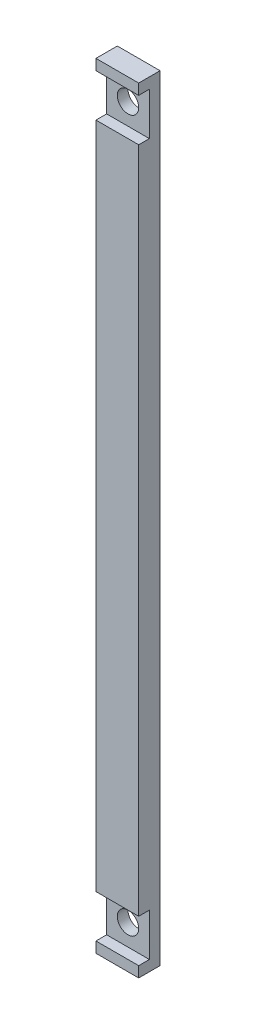
ISO-10303-21;
HEADER;
FILE_DESCRIPTION(('STEP AP214'),'2;1');
FILE_NAME('part.step','',(''),(''),'','','');
FILE_SCHEMA(('AUTOMOTIVE_DESIGN { 1 0 10303 214 1 1 1 1 }'));
ENDSEC;
DATA;
#1=APPLICATION_CONTEXT('core data for automotive mechanical design processes');
#2=APPLICATION_PROTOCOL_DEFINITION('international standard','automotive_design',2000,#1);
#3=PRODUCT_CONTEXT('',#1,'mechanical');
#4=PRODUCT('Part','Part','',(#3));
#5=PRODUCT_RELATED_PRODUCT_CATEGORY('part','',(#4));
#6=PRODUCT_DEFINITION_FORMATION('','',#4);
#7=PRODUCT_DEFINITION_CONTEXT('part definition',#1,'design');
#8=PRODUCT_DEFINITION('design','',#6,#7);
#9=PRODUCT_DEFINITION_SHAPE('','',#8);
#10=(LENGTH_UNIT() NAMED_UNIT(*) SI_UNIT(.MILLI.,.METRE.));
#11=(NAMED_UNIT(*) PLANE_ANGLE_UNIT() SI_UNIT($,.RADIAN.));
#12=(NAMED_UNIT(*) SI_UNIT($,.STERADIAN.) SOLID_ANGLE_UNIT());
#13=UNCERTAINTY_MEASURE_WITH_UNIT(LENGTH_MEASURE(1.E-05),#10,'distance_accuracy_value','');
#14=(GEOMETRIC_REPRESENTATION_CONTEXT(3) GLOBAL_UNCERTAINTY_ASSIGNED_CONTEXT((#13)) GLOBAL_UNIT_ASSIGNED_CONTEXT((#10,
#11,#12)) REPRESENTATION_CONTEXT('',''));
#15=CARTESIAN_POINT('',(0.,0.,0.));
#16=DIRECTION('',(0.,0.,1.));
#17=DIRECTION('',(1.,0.,0.));
#18=AXIS2_PLACEMENT_3D('',#15,#16,#17);
#19=CARTESIAN_POINT('',(0.,460.375,0.));
#20=DIRECTION('',(0.,0.,-1.));
#21=DIRECTION('',(-1.,0.,0.));
#22=AXIS2_PLACEMENT_3D('',#19,#20,#21);
#23=PLANE('',#22);
#24=DIRECTION('',(1.,0.,0.));
#25=VECTOR('',#24,1.);
#26=CARTESIAN_POINT('',(0.,428.625,0.));
#27=LINE('',#26,#25);
#28=CARTESIAN_POINT('',(0.,428.625,0.));
#29=VERTEX_POINT('',#28);
#30=CARTESIAN_POINT('',(25.4,428.625,0.));
#31=VERTEX_POINT('',#30);
#32=EDGE_CURVE('E133',#29,#31,#27,.T.);
#33=ORIENTED_EDGE('',*,*,#32,.F.);
#34=DIRECTION('',(0.,-1.,0.));
#35=VECTOR('',#34,1.);
#36=CARTESIAN_POINT('',(0.,460.375,0.));
#37=LINE('',#36,#35);
#38=CARTESIAN_POINT('',(0.,31.75,0.));
#39=VERTEX_POINT('',#38);
#40=EDGE_CURVE('E51',#29,#39,#37,.T.);
#41=ORIENTED_EDGE('',*,*,#40,.T.);
#42=DIRECTION('',(1.,0.,0.));
#43=VECTOR('',#42,1.);
#44=CARTESIAN_POINT('',(0.,31.75,0.));
#45=LINE('',#44,#43);
#46=CARTESIAN_POINT('',(25.4,31.75,0.));
#47=VERTEX_POINT('',#46);
#48=EDGE_CURVE('E211',#39,#47,#45,.T.);
#49=ORIENTED_EDGE('',*,*,#48,.T.);
#50=DIRECTION('',(0.,-1.,0.));
#51=VECTOR('',#50,1.);
#52=CARTESIAN_POINT('',(25.4,460.375,0.));
#53=LINE('',#52,#51);
#54=EDGE_CURVE('E146',#31,#47,#53,.T.);
#55=ORIENTED_EDGE('',*,*,#54,.F.);
#56=EDGE_LOOP('',(#33,#41,#49,#55));
#57=FACE_BOUND('',#56,.T.);
#58=ADVANCED_FACE('F43',(#57),#23,.F.);
#59=DIRECTION('',(1.,0.,0.));
#60=VECTOR('',#59,1.);
#61=CARTESIAN_POINT('',(0.,6.35,0.));
#62=LINE('',#61,#60);
#63=CARTESIAN_POINT('',(0.,6.35,0.));
#64=VERTEX_POINT('',#63);
#65=CARTESIAN_POINT('',(25.4,6.35,0.));
#66=VERTEX_POINT('',#65);
#67=EDGE_CURVE('E202',#64,#66,#62,.T.);
#68=ORIENTED_EDGE('',*,*,#67,.F.);
#69=CARTESIAN_POINT('',(0.,0.,0.));
#70=VERTEX_POINT('',#69);
#71=EDGE_CURVE('E55',#64,#70,#37,.T.);
#72=ORIENTED_EDGE('',*,*,#71,.T.);
#73=DIRECTION('',(1.,0.,0.));
#74=VECTOR('',#73,1.);
#75=CARTESIAN_POINT('',(0.,0.,0.));
#76=LINE('',#75,#74);
#77=CARTESIAN_POINT('',(25.4,0.,0.));
#78=VERTEX_POINT('',#77);
#79=EDGE_CURVE('E183',#70,#78,#76,.T.);
#80=ORIENTED_EDGE('',*,*,#79,.T.);
#81=EDGE_CURVE('E165',#66,#78,#53,.T.);
#82=ORIENTED_EDGE('',*,*,#81,.F.);
#83=EDGE_LOOP('',(#68,#72,#80,#82));
#84=FACE_BOUND('',#83,.T.);
#85=ADVANCED_FACE('F277',(#84),#23,.F.);
#86=CARTESIAN_POINT('',(25.4,460.375,0.));
#87=DIRECTION('',(-1.,0.,0.));
#88=DIRECTION('',(0.,0.,1.));
#89=AXIS2_PLACEMENT_3D('',#86,#87,#88);
#90=PLANE('',#89);
#91=DIRECTION('',(0.,0.,-1.));
#92=VECTOR('',#91,1.);
#93=CARTESIAN_POINT('',(25.4,428.625,0.));
#94=LINE('',#93,#92);
#95=CARTESIAN_POINT('',(25.4,428.625,-6.35));
#96=VERTEX_POINT('',#95);
#97=EDGE_CURVE('E56',#31,#96,#94,.T.);
#98=ORIENTED_EDGE('',*,*,#97,.F.);
#99=ORIENTED_EDGE('',*,*,#54,.T.);
#100=DIRECTION('',(0.,0.,1.));
#101=VECTOR('',#100,1.);
#102=CARTESIAN_POINT('',(25.4,31.75,0.));
#103=LINE('',#102,#101);
#104=CARTESIAN_POINT('',(25.4,31.75,-6.35000000000005));
#105=VERTEX_POINT('',#104);
#106=EDGE_CURVE('E203',#105,#47,#103,.T.);
#107=ORIENTED_EDGE('',*,*,#106,.F.);
#108=DIRECTION('',(0.,1.,0.));
#109=VECTOR('',#108,1.);
#110=CARTESIAN_POINT('',(25.4,6.35,-6.35000000000005));
#111=LINE('',#110,#109);
#112=CARTESIAN_POINT('',(25.4,6.34999999999997,-6.35000000000005));
#113=VERTEX_POINT('',#112);
#114=EDGE_CURVE('E210',#113,#105,#111,.T.);
#115=ORIENTED_EDGE('',*,*,#114,.F.);
#116=DIRECTION('',(0.,0.,-1.));
#117=VECTOR('',#116,1.);
#118=CARTESIAN_POINT('',(25.4,6.35,0.));
#119=LINE('',#118,#117);
#120=EDGE_CURVE('E66',#66,#113,#119,.T.);
#121=ORIENTED_EDGE('',*,*,#120,.F.);
#122=ORIENTED_EDGE('',*,*,#81,.T.);
#123=DIRECTION('',(0.,0.,-1.));
#124=VECTOR('',#123,1.);
#125=CARTESIAN_POINT('',(25.4,0.,0.));
#126=LINE('',#125,#124);
#127=CARTESIAN_POINT('',(25.4,0.,-12.7));
#128=VERTEX_POINT('',#127);
#129=EDGE_CURVE('E181',#78,#128,#126,.T.);
#130=ORIENTED_EDGE('',*,*,#129,.T.);
#131=DIRECTION('',(0.,-1.,0.));
#132=VECTOR('',#131,1.);
#133=CARTESIAN_POINT('',(25.4,460.375,-12.7));
#134=LINE('',#133,#132);
#135=CARTESIAN_POINT('',(25.4,460.375,-12.7));
#136=VERTEX_POINT('',#135);
#137=EDGE_CURVE('E169',#136,#128,#134,.T.);
#138=ORIENTED_EDGE('',*,*,#137,.F.);
#139=DIRECTION('',(0.,0.,-1.));
#140=VECTOR('',#139,1.);
#141=CARTESIAN_POINT('',(25.4,460.375,0.));
#142=LINE('',#141,#140);
#143=CARTESIAN_POINT('',(25.4,460.375,0.));
#144=VERTEX_POINT('',#143);
#145=EDGE_CURVE('E191',#144,#136,#142,.T.);
#146=ORIENTED_EDGE('',*,*,#145,.F.);
#147=CARTESIAN_POINT('',(25.4,454.025,0.));
#148=VERTEX_POINT('',#147);
#149=EDGE_CURVE('E154',#144,#148,#53,.T.);
#150=ORIENTED_EDGE('',*,*,#149,.T.);
#151=DIRECTION('',(0.,0.,1.));
#152=VECTOR('',#151,1.);
#153=CARTESIAN_POINT('',(25.4,454.025,0.));
#154=LINE('',#153,#152);
#155=CARTESIAN_POINT('',(25.4,454.025,-6.35));
#156=VERTEX_POINT('',#155);
#157=EDGE_CURVE('E143',#156,#148,#154,.T.);
#158=ORIENTED_EDGE('',*,*,#157,.F.);
#159=DIRECTION('',(0.,1.,0.));
#160=VECTOR('',#159,1.);
#161=CARTESIAN_POINT('',(25.4,454.025,-6.35));
#162=LINE('',#161,#160);
#163=EDGE_CURVE('E223',#96,#156,#162,.T.);
#164=ORIENTED_EDGE('',*,*,#163,.F.);
#165=EDGE_LOOP('',(#98,#99,#107,#115,#121,#122,#130,#138,#146,#150,#158,#164));
#166=FACE_BOUND('',#165,.T.);
#167=ADVANCED_FACE('F261',(#166),#90,.F.);
#168=CARTESIAN_POINT('',(0.,460.375,0.));
#169=DIRECTION('',(1.,0.,0.));
#170=DIRECTION('',(0.,0.,-1.));
#171=AXIS2_PLACEMENT_3D('',#168,#169,#170);
#172=PLANE('',#171);
#173=DIRECTION('',(0.,1.,0.));
#174=VECTOR('',#173,1.);
#175=CARTESIAN_POINT('',(0.,454.025,-6.35));
#176=LINE('',#175,#174);
#177=CARTESIAN_POINT('',(0.,428.625,-6.35));
#178=VERTEX_POINT('',#177);
#179=CARTESIAN_POINT('',(0.,454.025,-6.35));
#180=VERTEX_POINT('',#179);
#181=EDGE_CURVE('E137',#178,#180,#176,.T.);
#182=ORIENTED_EDGE('',*,*,#181,.T.);
#183=DIRECTION('',(0.,0.,1.));
#184=VECTOR('',#183,1.);
#185=CARTESIAN_POINT('',(0.,454.025,0.));
#186=LINE('',#185,#184);
#187=CARTESIAN_POINT('',(0.,454.025,0.));
#188=VERTEX_POINT('',#187);
#189=EDGE_CURVE('E149',#180,#188,#186,.T.);
#190=ORIENTED_EDGE('',*,*,#189,.T.);
#191=CARTESIAN_POINT('',(0.,460.375,0.));
#192=VERTEX_POINT('',#191);
#193=EDGE_CURVE('E11',#192,#188,#37,.T.);
#194=ORIENTED_EDGE('',*,*,#193,.F.);
#195=DIRECTION('',(0.,0.,1.));
#196=VECTOR('',#195,1.);
#197=CARTESIAN_POINT('',(0.,460.375,0.));
#198=LINE('',#197,#196);
#199=CARTESIAN_POINT('',(0.,460.375,-12.7));
#200=VERTEX_POINT('',#199);
#201=EDGE_CURVE('E185',#200,#192,#198,.T.);
#202=ORIENTED_EDGE('',*,*,#201,.F.);
#203=DIRECTION('',(0.,-1.,0.));
#204=VECTOR('',#203,1.);
#205=CARTESIAN_POINT('',(0.,460.375,-12.7));
#206=LINE('',#205,#204);
#207=CARTESIAN_POINT('',(0.,0.,-12.7));
#208=VERTEX_POINT('',#207);
#209=EDGE_CURVE('E171',#200,#208,#206,.T.);
#210=ORIENTED_EDGE('',*,*,#209,.T.);
#211=DIRECTION('',(0.,0.,1.));
#212=VECTOR('',#211,1.);
#213=CARTESIAN_POINT('',(0.,0.,0.));
#214=LINE('',#213,#212);
#215=EDGE_CURVE('E187',#208,#70,#214,.T.);
#216=ORIENTED_EDGE('',*,*,#215,.T.);
#217=ORIENTED_EDGE('',*,*,#71,.F.);
#218=DIRECTION('',(0.,0.,-1.));
#219=VECTOR('',#218,1.);
#220=CARTESIAN_POINT('',(0.,6.35,0.));
#221=LINE('',#220,#219);
#222=CARTESIAN_POINT('',(0.,6.35,-6.35000000000005));
#223=VERTEX_POINT('',#222);
#224=EDGE_CURVE('E196',#64,#223,#221,.T.);
#225=ORIENTED_EDGE('',*,*,#224,.T.);
#226=DIRECTION('',(0.,1.,0.));
#227=VECTOR('',#226,1.);
#228=CARTESIAN_POINT('',(0.,6.35,-6.35000000000005));
#229=LINE('',#228,#227);
#230=CARTESIAN_POINT('',(0.,31.75,-6.35000000000005));
#231=VERTEX_POINT('',#230);
#232=EDGE_CURVE('E205',#223,#231,#229,.T.);
#233=ORIENTED_EDGE('',*,*,#232,.T.);
#234=DIRECTION('',(0.,0.,1.));
#235=VECTOR('',#234,1.);
#236=CARTESIAN_POINT('',(0.,31.75,0.));
#237=LINE('',#236,#235);
#238=EDGE_CURVE('E152',#231,#39,#237,.T.);
#239=ORIENTED_EDGE('',*,*,#238,.T.);
#240=ORIENTED_EDGE('',*,*,#40,.F.);
#241=DIRECTION('',(0.,0.,-1.));
#242=VECTOR('',#241,1.);
#243=CARTESIAN_POINT('',(0.,428.625,0.));
#244=LINE('',#243,#242);
#245=EDGE_CURVE('E131',#29,#178,#244,.T.);
#246=ORIENTED_EDGE('',*,*,#245,.T.);
#247=EDGE_LOOP('',(#182,#190,#194,#202,#210,#216,#217,#225,#233,#239,#240,#246));
#248=FACE_BOUND('',#247,.T.);
#249=ADVANCED_FACE('F44',(#248),#172,.F.);
#250=ORIENTED_EDGE('',*,*,#193,.T.);
#251=DIRECTION('',(1.,0.,0.));
#252=VECTOR('',#251,1.);
#253=CARTESIAN_POINT('',(0.,454.025,0.));
#254=LINE('',#253,#252);
#255=EDGE_CURVE('E190',#188,#148,#254,.T.);
#256=ORIENTED_EDGE('',*,*,#255,.T.);
#257=ORIENTED_EDGE('',*,*,#149,.F.);
#258=DIRECTION('',(1.,0.,0.));
#259=VECTOR('',#258,1.);
#260=CARTESIAN_POINT('',(0.,460.375,0.));
#261=LINE('',#260,#259);
#262=EDGE_CURVE('E193',#192,#144,#261,.T.);
#263=ORIENTED_EDGE('',*,*,#262,.F.);
#264=EDGE_LOOP('',(#250,#256,#257,#263));
#265=FACE_BOUND('',#264,.T.);
#266=ADVANCED_FACE('F262',(#265),#23,.F.);
#267=CARTESIAN_POINT('',(0.,460.375,-12.7));
#268=DIRECTION('',(0.,0.,1.));
#269=DIRECTION('',(1.,0.,0.));
#270=AXIS2_PLACEMENT_3D('',#267,#268,#269);
#271=PLANE('',#270);
#272=CARTESIAN_POINT('',(12.7,441.325,-12.7));
#273=DIRECTION('',(0.,0.,1.));
#274=DIRECTION('',(1.,0.,0.));
#275=AXIS2_PLACEMENT_3D('',#272,#273,#274);
#276=CIRCLE('',#275,6.35);
#277=CARTESIAN_POINT('',(19.05,441.325,-12.7));
#278=VERTEX_POINT('',#277);
#279=EDGE_CURVE('E212',#278,#278,#276,.T.);
#280=ORIENTED_EDGE('',*,*,#279,.T.);
#281=EDGE_LOOP('',(#280));
#282=FACE_BOUND('',#281,.T.);
#283=CARTESIAN_POINT('',(12.7,19.05,-12.7));
#284=DIRECTION('',(0.,0.,1.));
#285=DIRECTION('',(1.,0.,0.));
#286=AXIS2_PLACEMENT_3D('',#283,#284,#285);
#287=CIRCLE('',#286,6.35);
#288=CARTESIAN_POINT('',(19.05,19.05,-12.7));
#289=VERTEX_POINT('',#288);
#290=EDGE_CURVE('E231',#289,#289,#287,.T.);
#291=ORIENTED_EDGE('',*,*,#290,.T.);
#292=EDGE_LOOP('',(#291));
#293=FACE_BOUND('',#292,.T.);
#294=DIRECTION('',(-1.,0.,0.));
#295=VECTOR('',#294,1.);
#296=CARTESIAN_POINT('',(0.,0.,-12.7));
#297=LINE('',#296,#295);
#298=EDGE_CURVE('E177',#128,#208,#297,.T.);
#299=ORIENTED_EDGE('',*,*,#298,.T.);
#300=ORIENTED_EDGE('',*,*,#209,.F.);
#301=DIRECTION('',(-1.,0.,0.));
#302=VECTOR('',#301,1.);
#303=CARTESIAN_POINT('',(0.,460.375,-12.7));
#304=LINE('',#303,#302);
#305=EDGE_CURVE('E176',#136,#200,#304,.T.);
#306=ORIENTED_EDGE('',*,*,#305,.F.);
#307=ORIENTED_EDGE('',*,*,#137,.T.);
#308=EDGE_LOOP('',(#299,#300,#306,#307));
#309=FACE_BOUND('',#308,.T.);
#310=ADVANCED_FACE('F243',(#282,#293,#309),#271,.F.);
#311=CARTESIAN_POINT('',(0.,460.375,0.));
#312=DIRECTION('',(0.,-1.,0.));
#313=DIRECTION('',(0.,0.,-1.));
#314=AXIS2_PLACEMENT_3D('',#311,#312,#313);
#315=PLANE('',#314);
#316=ORIENTED_EDGE('',*,*,#201,.T.);
#317=ORIENTED_EDGE('',*,*,#262,.T.);
#318=ORIENTED_EDGE('',*,*,#145,.T.);
#319=ORIENTED_EDGE('',*,*,#305,.T.);
#320=EDGE_LOOP('',(#316,#317,#318,#319));
#321=FACE_BOUND('',#320,.T.);
#322=ADVANCED_FACE('F269',(#321),#315,.F.);
#323=CARTESIAN_POINT('',(0.,0.,0.));
#324=DIRECTION('',(0.,-1.,0.));
#325=DIRECTION('',(0.,0.,-1.));
#326=AXIS2_PLACEMENT_3D('',#323,#324,#325);
#327=PLANE('',#326);
#328=ORIENTED_EDGE('',*,*,#215,.F.);
#329=ORIENTED_EDGE('',*,*,#298,.F.);
#330=ORIENTED_EDGE('',*,*,#129,.F.);
#331=ORIENTED_EDGE('',*,*,#79,.F.);
#332=EDGE_LOOP('',(#328,#329,#330,#331));
#333=FACE_BOUND('',#332,.T.);
#334=ADVANCED_FACE('F272',(#333),#327,.T.);
#335=CARTESIAN_POINT('',(0.,31.75,0.));
#336=DIRECTION('',(0.,1.,0.));
#337=DIRECTION('',(0.,0.,1.));
#338=AXIS2_PLACEMENT_3D('',#335,#336,#337);
#339=PLANE('',#338);
#340=ORIENTED_EDGE('',*,*,#106,.T.);
#341=ORIENTED_EDGE('',*,*,#48,.F.);
#342=ORIENTED_EDGE('',*,*,#238,.F.);
#343=DIRECTION('',(1.,0.,0.));
#344=VECTOR('',#343,1.);
#345=CARTESIAN_POINT('',(0.,31.75,-6.35000000000005));
#346=LINE('',#345,#344);
#347=EDGE_CURVE('E213',#231,#105,#346,.T.);
#348=ORIENTED_EDGE('',*,*,#347,.T.);
#349=EDGE_LOOP('',(#340,#341,#342,#348));
#350=FACE_BOUND('',#349,.T.);
#351=ADVANCED_FACE('F318',(#350),#339,.F.);
#352=CARTESIAN_POINT('',(0.,6.35,-6.35000000000005));
#353=DIRECTION('',(0.,0.,-1.));
#354=DIRECTION('',(0.,1.,0.));
#355=AXIS2_PLACEMENT_3D('',#352,#353,#354);
#356=PLANE('',#355);
#357=CARTESIAN_POINT('',(12.7,19.05,-6.35000000000006));
#358=DIRECTION('',(0.,0.,1.));
#359=DIRECTION('',(1.,0.,0.));
#360=AXIS2_PLACEMENT_3D('',#357,#358,#359);
#361=CIRCLE('',#360,6.35);
#362=CARTESIAN_POINT('',(19.05,19.05,-6.35000000000006));
#363=VERTEX_POINT('',#362);
#364=EDGE_CURVE('E232',#363,#363,#361,.T.);
#365=ORIENTED_EDGE('',*,*,#364,.F.);
#366=EDGE_LOOP('',(#365));
#367=FACE_BOUND('',#366,.T.);
#368=ORIENTED_EDGE('',*,*,#114,.T.);
#369=ORIENTED_EDGE('',*,*,#347,.F.);
#370=ORIENTED_EDGE('',*,*,#232,.F.);
#371=DIRECTION('',(1.,0.,0.));
#372=VECTOR('',#371,1.);
#373=CARTESIAN_POINT('',(0.,6.35,-6.35000000000005));
#374=LINE('',#373,#372);
#375=EDGE_CURVE('E216',#223,#113,#374,.T.);
#376=ORIENTED_EDGE('',*,*,#375,.T.);
#377=EDGE_LOOP('',(#368,#369,#370,#376));
#378=FACE_BOUND('',#377,.T.);
#379=ADVANCED_FACE('F325',(#367,#378),#356,.F.);
#380=CARTESIAN_POINT('',(0.,6.35,0.));
#381=DIRECTION('',(0.,-1.,0.));
#382=DIRECTION('',(0.,0.,-1.));
#383=AXIS2_PLACEMENT_3D('',#380,#381,#382);
#384=PLANE('',#383);
#385=ORIENTED_EDGE('',*,*,#120,.T.);
#386=ORIENTED_EDGE('',*,*,#375,.F.);
#387=ORIENTED_EDGE('',*,*,#224,.F.);
#388=ORIENTED_EDGE('',*,*,#67,.T.);
#389=EDGE_LOOP('',(#385,#386,#387,#388));
#390=FACE_BOUND('',#389,.T.);
#391=ADVANCED_FACE('F274',(#390),#384,.F.);
#392=CARTESIAN_POINT('',(0.,454.025,0.));
#393=DIRECTION('',(0.,1.,0.));
#394=DIRECTION('',(0.,0.,1.));
#395=AXIS2_PLACEMENT_3D('',#392,#393,#394);
#396=PLANE('',#395);
#397=ORIENTED_EDGE('',*,*,#157,.T.);
#398=ORIENTED_EDGE('',*,*,#255,.F.);
#399=ORIENTED_EDGE('',*,*,#189,.F.);
#400=DIRECTION('',(1.,0.,0.));
#401=VECTOR('',#400,1.);
#402=CARTESIAN_POINT('',(0.,454.025,-6.35));
#403=LINE('',#402,#401);
#404=EDGE_CURVE('E219',#180,#156,#403,.T.);
#405=ORIENTED_EDGE('',*,*,#404,.T.);
#406=EDGE_LOOP('',(#397,#398,#399,#405));
#407=FACE_BOUND('',#406,.T.);
#408=ADVANCED_FACE('F260',(#407),#396,.F.);
#409=CARTESIAN_POINT('',(0.,454.025,-6.35));
#410=DIRECTION('',(0.,0.,-1.));
#411=DIRECTION('',(0.,1.,0.));
#412=AXIS2_PLACEMENT_3D('',#409,#410,#411);
#413=PLANE('',#412);
#414=CARTESIAN_POINT('',(12.7,441.325,-6.35000000000006));
#415=DIRECTION('',(0.,0.,1.));
#416=DIRECTION('',(1.,0.,0.));
#417=AXIS2_PLACEMENT_3D('',#414,#415,#416);
#418=CIRCLE('',#417,6.35);
#419=CARTESIAN_POINT('',(19.05,441.325,-6.35000000000006));
#420=VERTEX_POINT('',#419);
#421=EDGE_CURVE('E236',#420,#420,#418,.T.);
#422=ORIENTED_EDGE('',*,*,#421,.F.);
#423=EDGE_LOOP('',(#422));
#424=FACE_BOUND('',#423,.T.);
#425=ORIENTED_EDGE('',*,*,#163,.T.);
#426=ORIENTED_EDGE('',*,*,#404,.F.);
#427=ORIENTED_EDGE('',*,*,#181,.F.);
#428=DIRECTION('',(1.,0.,0.));
#429=VECTOR('',#428,1.);
#430=CARTESIAN_POINT('',(0.,428.625,-6.35));
#431=LINE('',#430,#429);
#432=EDGE_CURVE('E135',#178,#96,#431,.T.);
#433=ORIENTED_EDGE('',*,*,#432,.T.);
#434=EDGE_LOOP('',(#425,#426,#427,#433));
#435=FACE_BOUND('',#434,.T.);
#436=ADVANCED_FACE('F255',(#424,#435),#413,.F.);
#437=CARTESIAN_POINT('',(0.,428.625,0.));
#438=DIRECTION('',(0.,-1.,0.));
#439=DIRECTION('',(0.,0.,-1.));
#440=AXIS2_PLACEMENT_3D('',#437,#438,#439);
#441=PLANE('',#440);
#442=ORIENTED_EDGE('',*,*,#97,.T.);
#443=ORIENTED_EDGE('',*,*,#432,.F.);
#444=ORIENTED_EDGE('',*,*,#245,.F.);
#445=ORIENTED_EDGE('',*,*,#32,.T.);
#446=EDGE_LOOP('',(#442,#443,#444,#445));
#447=FACE_BOUND('',#446,.T.);
#448=ADVANCED_FACE('F134',(#447),#441,.F.);
#449=CARTESIAN_POINT('',(12.7,441.325,-12.7));
#450=DIRECTION('',(0.,0.,1.));
#451=DIRECTION('',(1.,0.,0.));
#452=AXIS2_PLACEMENT_3D('',#449,#450,#451);
#453=CYLINDRICAL_SURFACE('',#452,6.35);
#454=ORIENTED_EDGE('',*,*,#279,.F.);
#455=EDGE_LOOP('',(#454));
#456=FACE_BOUND('',#455,.T.);
#457=ORIENTED_EDGE('',*,*,#421,.T.);
#458=EDGE_LOOP('',(#457));
#459=FACE_BOUND('',#458,.T.);
#460=ADVANCED_FACE('F246',(#456,#459),#453,.F.);
#461=CARTESIAN_POINT('',(12.7,19.05,-12.7));
#462=DIRECTION('',(0.,0.,1.));
#463=DIRECTION('',(1.,0.,0.));
#464=AXIS2_PLACEMENT_3D('',#461,#462,#463);
#465=CYLINDRICAL_SURFACE('',#464,6.35);
#466=ORIENTED_EDGE('',*,*,#290,.F.);
#467=EDGE_LOOP('',(#466));
#468=FACE_BOUND('',#467,.T.);
#469=ORIENTED_EDGE('',*,*,#364,.T.);
#470=EDGE_LOOP('',(#469));
#471=FACE_BOUND('',#470,.T.);
#472=ADVANCED_FACE('F247',(#468,#471),#465,.F.);
#473=CLOSED_SHELL('',(#58,#85,#167,#249,#266,#310,#322,#334,#351,#379,#391,#408,#436,#448,#460,#472));
#474=MANIFOLD_SOLID_BREP('B2',#473);
#475=ADVANCED_BREP_SHAPE_REPRESENTATION('',(#18,#474),#14);
#476=SHAPE_DEFINITION_REPRESENTATION(#9,#475);
ENDSEC;
END-ISO-10303-21;
